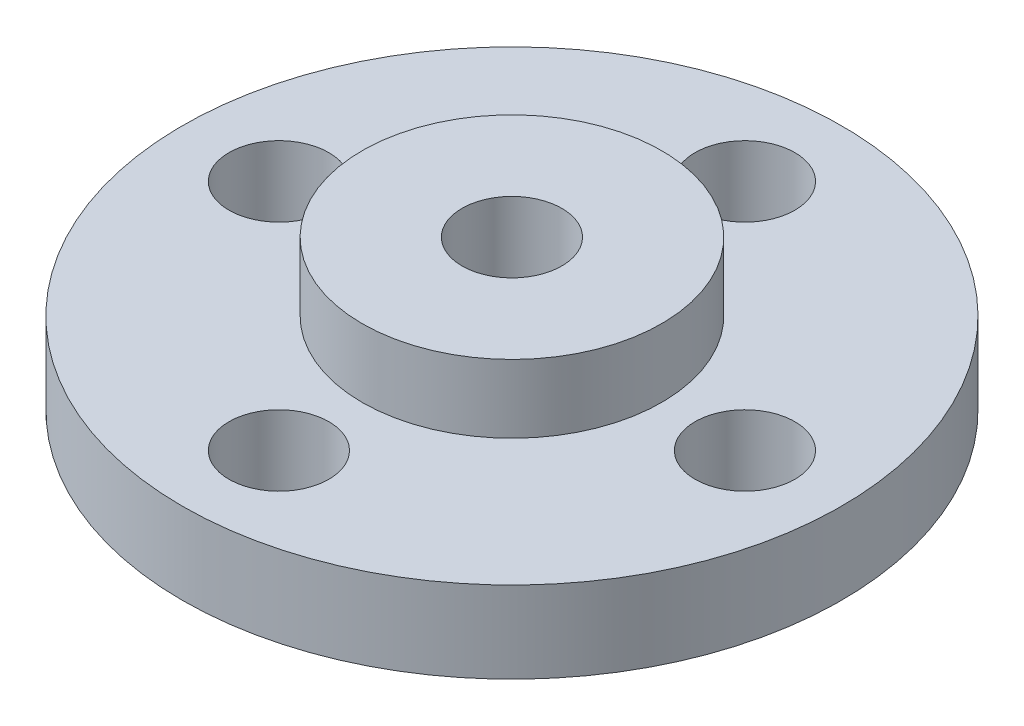
ISO-10303-21;
HEADER;
FILE_DESCRIPTION(('STEP AP214'),'2;1');
FILE_NAME('part.step','',(''),(''),'','','');
FILE_SCHEMA(('AUTOMOTIVE_DESIGN { 1 0 10303 214 1 1 1 1 }'));
ENDSEC;
DATA;
#1=APPLICATION_CONTEXT('core data for automotive mechanical design processes');
#2=APPLICATION_PROTOCOL_DEFINITION('international standard','automotive_design',2000,#1);
#3=PRODUCT_CONTEXT('',#1,'mechanical');
#4=PRODUCT('Part','Part','',(#3));
#5=PRODUCT_RELATED_PRODUCT_CATEGORY('part','',(#4));
#6=PRODUCT_DEFINITION_FORMATION('','',#4);
#7=PRODUCT_DEFINITION_CONTEXT('part definition',#1,'design');
#8=PRODUCT_DEFINITION('design','',#6,#7);
#9=PRODUCT_DEFINITION_SHAPE('','',#8);
#10=(LENGTH_UNIT() NAMED_UNIT(*) SI_UNIT(.MILLI.,.METRE.));
#11=(NAMED_UNIT(*) PLANE_ANGLE_UNIT() SI_UNIT($,.RADIAN.));
#12=(NAMED_UNIT(*) SI_UNIT($,.STERADIAN.) SOLID_ANGLE_UNIT());
#13=UNCERTAINTY_MEASURE_WITH_UNIT(LENGTH_MEASURE(1.E-05),#10,'distance_accuracy_value','');
#14=(GEOMETRIC_REPRESENTATION_CONTEXT(3) GLOBAL_UNCERTAINTY_ASSIGNED_CONTEXT((#13)) GLOBAL_UNIT_ASSIGNED_CONTEXT((#10,
#11,#12)) REPRESENTATION_CONTEXT('',''));
#15=CARTESIAN_POINT('',(0.,0.,0.));
#16=DIRECTION('',(0.,0.,1.));
#17=DIRECTION('',(1.,0.,0.));
#18=AXIS2_PLACEMENT_3D('',#15,#16,#17);
#19=CARTESIAN_POINT('',(0.,2.45,0.));
#20=DIRECTION('',(0.,-1.,0.));
#21=DIRECTION('',(0.,0.,-1.));
#22=AXIS2_PLACEMENT_3D('',#19,#20,#21);
#23=CYLINDRICAL_SURFACE('',#22,9.9);
#24=CARTESIAN_POINT('',(0.,2.45,0.));
#25=DIRECTION('',(0.,1.,0.));
#26=DIRECTION('',(0.,0.,1.));
#27=AXIS2_PLACEMENT_3D('',#24,#25,#26);
#28=CIRCLE('',#27,9.9);
#29=CARTESIAN_POINT('',(0.,2.45,9.9));
#30=VERTEX_POINT('',#29);
#31=EDGE_CURVE('E10',#30,#30,#28,.T.);
#32=ORIENTED_EDGE('',*,*,#31,.F.);
#33=EDGE_LOOP('',(#32));
#34=FACE_BOUND('',#33,.T.);
#35=CARTESIAN_POINT('',(0.,0.,0.));
#36=DIRECTION('',(0.,1.,0.));
#37=DIRECTION('',(0.,0.,1.));
#38=AXIS2_PLACEMENT_3D('',#35,#36,#37);
#39=CIRCLE('',#38,9.9);
#40=CARTESIAN_POINT('',(0.,0.,9.9));
#41=VERTEX_POINT('',#40);
#42=EDGE_CURVE('E46',#41,#41,#39,.T.);
#43=ORIENTED_EDGE('',*,*,#42,.T.);
#44=EDGE_LOOP('',(#43));
#45=FACE_BOUND('',#44,.T.);
#46=ADVANCED_FACE('F43',(#34,#45),#23,.T.);
#47=CARTESIAN_POINT('',(0.,2.45,0.));
#48=DIRECTION('',(0.,1.,0.));
#49=DIRECTION('',(0.,0.,1.));
#50=AXIS2_PLACEMENT_3D('',#47,#48,#49);
#51=PLANE('',#50);
#52=CARTESIAN_POINT('',(0.,2.45,7.));
#53=DIRECTION('',(0.,1.,0.));
#54=DIRECTION('',(-1.,0.,0.));
#55=AXIS2_PLACEMENT_3D('',#52,#53,#54);
#56=CIRCLE('',#55,1.5);
#57=CARTESIAN_POINT('',(-1.50000000000002,2.45,6.99999999999999));
#58=VERTEX_POINT('',#57);
#59=EDGE_CURVE('E97',#58,#58,#56,.T.);
#60=ORIENTED_EDGE('',*,*,#59,.F.);
#61=EDGE_LOOP('',(#60));
#62=FACE_BOUND('',#61,.T.);
#63=CARTESIAN_POINT('',(-7.,2.45,0.));
#64=DIRECTION('',(0.,1.,0.));
#65=DIRECTION('',(0.,0.,-1.));
#66=AXIS2_PLACEMENT_3D('',#63,#64,#65);
#67=CIRCLE('',#66,1.5);
#68=CARTESIAN_POINT('',(-7.,2.45,-1.5));
#69=VERTEX_POINT('',#68);
#70=EDGE_CURVE('E89',#69,#69,#67,.T.);
#71=ORIENTED_EDGE('',*,*,#70,.F.);
#72=EDGE_LOOP('',(#71));
#73=FACE_BOUND('',#72,.T.);
#74=CARTESIAN_POINT('',(0.,2.45,-7.));
#75=DIRECTION('',(0.,1.,0.));
#76=DIRECTION('',(1.,0.,0.));
#77=AXIS2_PLACEMENT_3D('',#74,#75,#76);
#78=CIRCLE('',#77,1.5);
#79=CARTESIAN_POINT('',(1.50000000000007,2.45,-6.99999999999998));
#80=VERTEX_POINT('',#79);
#81=EDGE_CURVE('E81',#80,#80,#78,.T.);
#82=ORIENTED_EDGE('',*,*,#81,.F.);
#83=EDGE_LOOP('',(#82));
#84=FACE_BOUND('',#83,.T.);
#85=CARTESIAN_POINT('',(7.,2.45,0.));
#86=DIRECTION('',(0.,1.,0.));
#87=DIRECTION('',(0.,0.,1.));
#88=AXIS2_PLACEMENT_3D('',#85,#86,#87);
#89=CIRCLE('',#88,1.5);
#90=CARTESIAN_POINT('',(7.,2.45,1.5));
#91=VERTEX_POINT('',#90);
#92=EDGE_CURVE('E73',#91,#91,#89,.T.);
#93=ORIENTED_EDGE('',*,*,#92,.F.);
#94=EDGE_LOOP('',(#93));
#95=FACE_BOUND('',#94,.T.);
#96=CARTESIAN_POINT('',(0.,2.45,0.));
#97=DIRECTION('',(0.,1.,0.));
#98=DIRECTION('',(0.,0.,1.));
#99=AXIS2_PLACEMENT_3D('',#96,#97,#98);
#100=CIRCLE('',#99,4.5);
#101=CARTESIAN_POINT('',(0.,2.45,4.5));
#102=VERTEX_POINT('',#101);
#103=EDGE_CURVE('E57',#102,#102,#100,.T.);
#104=ORIENTED_EDGE('',*,*,#103,.F.);
#105=EDGE_LOOP('',(#104));
#106=FACE_BOUND('',#105,.T.);
#107=ORIENTED_EDGE('',*,*,#31,.T.);
#108=EDGE_LOOP('',(#107));
#109=FACE_BOUND('',#108,.T.);
#110=ADVANCED_FACE('F115',(#62,#73,#84,#95,#106,#109),#51,.T.);
#111=CARTESIAN_POINT('',(0.,0.,0.));
#112=DIRECTION('',(0.,1.,0.));
#113=DIRECTION('',(0.,0.,1.));
#114=AXIS2_PLACEMENT_3D('',#111,#112,#113);
#115=PLANE('',#114);
#116=CARTESIAN_POINT('',(0.,0.,7.));
#117=DIRECTION('',(0.,1.,0.));
#118=DIRECTION('',(-1.,0.,0.));
#119=AXIS2_PLACEMENT_3D('',#116,#117,#118);
#120=CIRCLE('',#119,1.5);
#121=CARTESIAN_POINT('',(-1.50000000000002,0.,6.99999999999999));
#122=VERTEX_POINT('',#121);
#123=EDGE_CURVE('E77',#122,#122,#120,.T.);
#124=ORIENTED_EDGE('',*,*,#123,.T.);
#125=EDGE_LOOP('',(#124));
#126=FACE_BOUND('',#125,.T.);
#127=CARTESIAN_POINT('',(-7.,0.,0.));
#128=DIRECTION('',(0.,1.,0.));
#129=DIRECTION('',(0.,0.,-1.));
#130=AXIS2_PLACEMENT_3D('',#127,#128,#129);
#131=CIRCLE('',#130,1.5);
#132=CARTESIAN_POINT('',(-7.,0.,-1.5));
#133=VERTEX_POINT('',#132);
#134=EDGE_CURVE('E93',#133,#133,#131,.T.);
#135=ORIENTED_EDGE('',*,*,#134,.T.);
#136=EDGE_LOOP('',(#135));
#137=FACE_BOUND('',#136,.T.);
#138=CARTESIAN_POINT('',(0.,0.,-7.));
#139=DIRECTION('',(0.,1.,0.));
#140=DIRECTION('',(1.,0.,0.));
#141=AXIS2_PLACEMENT_3D('',#138,#139,#140);
#142=CIRCLE('',#141,1.5);
#143=CARTESIAN_POINT('',(1.50000000000007,0.,-6.99999999999998));
#144=VERTEX_POINT('',#143);
#145=EDGE_CURVE('E85',#144,#144,#142,.T.);
#146=ORIENTED_EDGE('',*,*,#145,.T.);
#147=EDGE_LOOP('',(#146));
#148=FACE_BOUND('',#147,.T.);
#149=CARTESIAN_POINT('',(7.,0.,0.));
#150=DIRECTION('',(0.,1.,0.));
#151=DIRECTION('',(0.,0.,1.));
#152=AXIS2_PLACEMENT_3D('',#149,#150,#151);
#153=CIRCLE('',#152,1.5);
#154=CARTESIAN_POINT('',(7.,0.,1.5));
#155=VERTEX_POINT('',#154);
#156=EDGE_CURVE('E72',#155,#155,#153,.T.);
#157=ORIENTED_EDGE('',*,*,#156,.T.);
#158=EDGE_LOOP('',(#157));
#159=FACE_BOUND('',#158,.T.);
#160=CARTESIAN_POINT('',(0.,0.,0.));
#161=DIRECTION('',(0.,1.,0.));
#162=DIRECTION('',(0.,0.,1.));
#163=AXIS2_PLACEMENT_3D('',#160,#161,#162);
#164=CIRCLE('',#163,1.5);
#165=CARTESIAN_POINT('',(0.,0.,1.5));
#166=VERTEX_POINT('',#165);
#167=EDGE_CURVE('E68',#166,#166,#164,.T.);
#168=ORIENTED_EDGE('',*,*,#167,.T.);
#169=EDGE_LOOP('',(#168));
#170=FACE_BOUND('',#169,.T.);
#171=ORIENTED_EDGE('',*,*,#42,.F.);
#172=EDGE_LOOP('',(#171));
#173=FACE_BOUND('',#172,.T.);
#174=ADVANCED_FACE('F105',(#126,#137,#148,#159,#170,#173),#115,.F.);
#175=CARTESIAN_POINT('',(0.,4.5,0.));
#176=DIRECTION('',(0.,1.,0.));
#177=DIRECTION('',(0.,0.,1.));
#178=AXIS2_PLACEMENT_3D('',#175,#176,#177);
#179=PLANE('',#178);
#180=CARTESIAN_POINT('',(0.,4.5,0.));
#181=DIRECTION('',(0.,1.,0.));
#182=DIRECTION('',(0.,0.,1.));
#183=AXIS2_PLACEMENT_3D('',#180,#181,#182);
#184=CIRCLE('',#183,4.5);
#185=CARTESIAN_POINT('',(0.,4.5,4.5));
#186=VERTEX_POINT('',#185);
#187=EDGE_CURVE('E55',#186,#186,#184,.T.);
#188=ORIENTED_EDGE('',*,*,#187,.T.);
#189=EDGE_LOOP('',(#188));
#190=FACE_BOUND('',#189,.T.);
#191=CARTESIAN_POINT('',(0.,4.5,0.));
#192=DIRECTION('',(0.,1.,0.));
#193=DIRECTION('',(0.,0.,1.));
#194=AXIS2_PLACEMENT_3D('',#191,#192,#193);
#195=CIRCLE('',#194,1.5);
#196=CARTESIAN_POINT('',(0.,4.5,1.5));
#197=VERTEX_POINT('',#196);
#198=EDGE_CURVE('E61',#197,#197,#195,.T.);
#199=ORIENTED_EDGE('',*,*,#198,.F.);
#200=EDGE_LOOP('',(#199));
#201=FACE_BOUND('',#200,.T.);
#202=ADVANCED_FACE('F130',(#190,#201),#179,.T.);
#203=CARTESIAN_POINT('',(0.,4.5,0.));
#204=DIRECTION('',(0.,-1.,0.));
#205=DIRECTION('',(0.,0.,-1.));
#206=AXIS2_PLACEMENT_3D('',#203,#204,#205);
#207=CYLINDRICAL_SURFACE('',#206,4.5);
#208=ORIENTED_EDGE('',*,*,#187,.F.);
#209=EDGE_LOOP('',(#208));
#210=FACE_BOUND('',#209,.T.);
#211=ORIENTED_EDGE('',*,*,#103,.T.);
#212=EDGE_LOOP('',(#211));
#213=FACE_BOUND('',#212,.T.);
#214=ADVANCED_FACE('F127',(#210,#213),#207,.T.);
#215=CARTESIAN_POINT('',(0.,4.5,0.));
#216=DIRECTION('',(0.,-1.,0.));
#217=DIRECTION('',(0.,0.,-1.));
#218=AXIS2_PLACEMENT_3D('',#215,#216,#217);
#219=CYLINDRICAL_SURFACE('',#218,1.5);
#220=ORIENTED_EDGE('',*,*,#198,.T.);
#221=EDGE_LOOP('',(#220));
#222=FACE_BOUND('',#221,.T.);
#223=ORIENTED_EDGE('',*,*,#167,.F.);
#224=EDGE_LOOP('',(#223));
#225=FACE_BOUND('',#224,.T.);
#226=ADVANCED_FACE('F129',(#222,#225),#219,.F.);
#227=CARTESIAN_POINT('',(7.,0.,0.));
#228=DIRECTION('',(0.,1.,0.));
#229=DIRECTION('',(0.,0.,1.));
#230=AXIS2_PLACEMENT_3D('',#227,#228,#229);
#231=CYLINDRICAL_SURFACE('',#230,1.5);
#232=ORIENTED_EDGE('',*,*,#156,.F.);
#233=EDGE_LOOP('',(#232));
#234=FACE_BOUND('',#233,.T.);
#235=ORIENTED_EDGE('',*,*,#92,.T.);
#236=EDGE_LOOP('',(#235));
#237=FACE_BOUND('',#236,.T.);
#238=ADVANCED_FACE('F137',(#234,#237),#231,.F.);
#239=CARTESIAN_POINT('',(0.,0.,-7.));
#240=DIRECTION('',(0.,1.,0.));
#241=DIRECTION('',(0.,0.,1.));
#242=AXIS2_PLACEMENT_3D('',#239,#240,#241);
#243=CYLINDRICAL_SURFACE('',#242,1.5);
#244=ORIENTED_EDGE('',*,*,#145,.F.);
#245=EDGE_LOOP('',(#244));
#246=FACE_BOUND('',#245,.T.);
#247=ORIENTED_EDGE('',*,*,#81,.T.);
#248=EDGE_LOOP('',(#247));
#249=FACE_BOUND('',#248,.T.);
#250=ADVANCED_FACE('F161',(#246,#249),#243,.F.);
#251=CARTESIAN_POINT('',(-7.,0.,0.));
#252=DIRECTION('',(0.,1.,0.));
#253=DIRECTION('',(0.,0.,1.));
#254=AXIS2_PLACEMENT_3D('',#251,#252,#253);
#255=CYLINDRICAL_SURFACE('',#254,1.5);
#256=ORIENTED_EDGE('',*,*,#134,.F.);
#257=EDGE_LOOP('',(#256));
#258=FACE_BOUND('',#257,.T.);
#259=ORIENTED_EDGE('',*,*,#70,.T.);
#260=EDGE_LOOP('',(#259));
#261=FACE_BOUND('',#260,.T.);
#262=ADVANCED_FACE('F111',(#258,#261),#255,.F.);
#263=CARTESIAN_POINT('',(0.,0.,7.));
#264=DIRECTION('',(0.,1.,0.));
#265=DIRECTION('',(0.,0.,1.));
#266=AXIS2_PLACEMENT_3D('',#263,#264,#265);
#267=CYLINDRICAL_SURFACE('',#266,1.5);
#268=ORIENTED_EDGE('',*,*,#123,.F.);
#269=EDGE_LOOP('',(#268));
#270=FACE_BOUND('',#269,.T.);
#271=ORIENTED_EDGE('',*,*,#59,.T.);
#272=EDGE_LOOP('',(#271));
#273=FACE_BOUND('',#272,.T.);
#274=ADVANCED_FACE('F108',(#270,#273),#267,.F.);
#275=CLOSED_SHELL('',(#46,#110,#174,#202,#214,#226,#238,#250,#262,#274));
#276=MANIFOLD_SOLID_BREP('B2',#275);
#277=ADVANCED_BREP_SHAPE_REPRESENTATION('',(#18,#276),#14);
#278=SHAPE_DEFINITION_REPRESENTATION(#9,#277);
ENDSEC;
END-ISO-10303-21;
